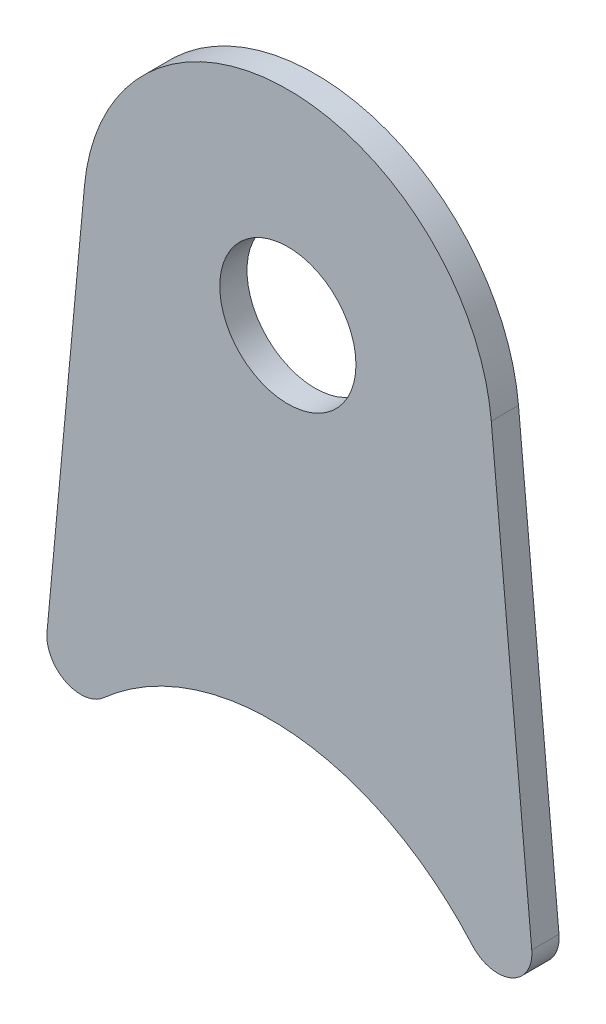
ISO-10303-21;
HEADER;
FILE_DESCRIPTION(('STEP AP214'),'2;1');
FILE_NAME('part.step','',(''),(''),'','','');
FILE_SCHEMA(('AUTOMOTIVE_DESIGN { 1 0 10303 214 1 1 1 1 }'));
ENDSEC;
DATA;
#1=APPLICATION_CONTEXT('core data for automotive mechanical design processes');
#2=APPLICATION_PROTOCOL_DEFINITION('international standard','automotive_design',2000,#1);
#3=PRODUCT_CONTEXT('',#1,'mechanical');
#4=PRODUCT('Part','Part','',(#3));
#5=PRODUCT_RELATED_PRODUCT_CATEGORY('part','',(#4));
#6=PRODUCT_DEFINITION_FORMATION('','',#4);
#7=PRODUCT_DEFINITION_CONTEXT('part definition',#1,'design');
#8=PRODUCT_DEFINITION('design','',#6,#7);
#9=PRODUCT_DEFINITION_SHAPE('','',#8);
#10=(LENGTH_UNIT() NAMED_UNIT(*) SI_UNIT(.MILLI.,.METRE.));
#11=(NAMED_UNIT(*) PLANE_ANGLE_UNIT() SI_UNIT($,.RADIAN.));
#12=(NAMED_UNIT(*) SI_UNIT($,.STERADIAN.) SOLID_ANGLE_UNIT());
#13=UNCERTAINTY_MEASURE_WITH_UNIT(LENGTH_MEASURE(1.E-05),#10,'distance_accuracy_value','');
#14=(GEOMETRIC_REPRESENTATION_CONTEXT(3) GLOBAL_UNCERTAINTY_ASSIGNED_CONTEXT((#13)) GLOBAL_UNIT_ASSIGNED_CONTEXT((#10,
#11,#12)) REPRESENTATION_CONTEXT('',''));
#15=CARTESIAN_POINT('',(0.,0.,0.));
#16=DIRECTION('',(0.,0.,1.));
#17=DIRECTION('',(1.,0.,0.));
#18=AXIS2_PLACEMENT_3D('',#15,#16,#17);
#19=CARTESIAN_POINT('',(12.7,-33.8997234501994,0.635));
#20=DIRECTION('',(0.99575277517188,0.0920674249531236,0.));
#21=DIRECTION('',(-0.0920674249531236,0.99575277517188,0.));
#22=AXIS2_PLACEMENT_3D('',#19,#20,#21);
#23=PLANE('',#22);
#24=DIRECTION('',(-0.0920674249531236,0.99575277517188,0.));
#25=VECTOR('',#24,1.);
#26=CARTESIAN_POINT('',(12.7,-33.8997234501994,0.635));
#27=LINE('',#26,#25);
#28=CARTESIAN_POINT('',(11.3719193962476,-19.5359031574981,0.635));
#29=VERTEX_POINT('',#28);
#30=CARTESIAN_POINT('',(9.48454518351216,0.876942222678502,0.635));
#31=VERTEX_POINT('',#30);
#32=EDGE_CURVE('E127',#29,#31,#27,.T.);
#33=ORIENTED_EDGE('',*,*,#32,.F.);
#34=DIRECTION('',(0.,0.,1.));
#35=VECTOR('',#34,1.);
#36=CARTESIAN_POINT('',(11.3719193962476,-19.5359031574981,-0.635));
#37=LINE('',#36,#35);
#38=CARTESIAN_POINT('',(11.3719193962476,-19.5359031574981,-0.635));
#39=VERTEX_POINT('',#38);
#40=EDGE_CURVE('E113',#39,#29,#37,.T.);
#41=ORIENTED_EDGE('',*,*,#40,.F.);
#42=DIRECTION('',(-0.0920674249531236,0.99575277517188,0.));
#43=VECTOR('',#42,1.);
#44=CARTESIAN_POINT('',(12.7,-33.8997234501994,-0.635));
#45=LINE('',#44,#43);
#46=CARTESIAN_POINT('',(9.48454518351216,0.876942222678502,-0.635));
#47=VERTEX_POINT('',#46);
#48=EDGE_CURVE('E125',#39,#47,#45,.T.);
#49=ORIENTED_EDGE('',*,*,#48,.T.);
#50=DIRECTION('',(0.,0.,1.));
#51=VECTOR('',#50,1.);
#52=CARTESIAN_POINT('',(9.48454518351216,0.876942222678502,0.635));
#53=LINE('',#52,#51);
#54=EDGE_CURVE('E137',#47,#31,#53,.T.);
#55=ORIENTED_EDGE('',*,*,#54,.T.);
#56=EDGE_LOOP('',(#33,#41,#49,#55));
#57=FACE_BOUND('',#56,.T.);
#58=ADVANCED_FACE('F45',(#57),#23,.T.);
#59=CARTESIAN_POINT('',(-9.48454518351216,0.876942222678502,0.635));
#60=DIRECTION('',(-0.99575277517188,0.0920674249531236,0.));
#61=DIRECTION('',(-0.0920674249531236,-0.99575277517188,0.));
#62=AXIS2_PLACEMENT_3D('',#59,#60,#61);
#63=PLANE('',#62);
#64=DIRECTION('',(-0.0920674249531236,-0.99575277517188,0.));
#65=VECTOR('',#64,1.);
#66=CARTESIAN_POINT('',(-9.48454518351216,0.876942222678502,-0.635));
#67=LINE('',#66,#65);
#68=CARTESIAN_POINT('',(-9.48454518351216,0.876942222678502,-0.635));
#69=VERTEX_POINT('',#68);
#70=CARTESIAN_POINT('',(-11.2300340747714,-18.001346253273,-0.635));
#71=VERTEX_POINT('',#70);
#72=EDGE_CURVE('E145',#69,#71,#67,.T.);
#73=ORIENTED_EDGE('',*,*,#72,.T.);
#74=DIRECTION('',(0.,0.,-1.));
#75=VECTOR('',#74,1.);
#76=CARTESIAN_POINT('',(-11.2300340747714,-18.001346253273,0.635));
#77=LINE('',#76,#75);
#78=CARTESIAN_POINT('',(-11.2300340747714,-18.001346253273,0.635));
#79=VERTEX_POINT('',#78);
#80=EDGE_CURVE('E163',#71,#79,#77,.F.);
#81=ORIENTED_EDGE('',*,*,#80,.T.);
#82=DIRECTION('',(-0.0920674249531236,-0.99575277517188,0.));
#83=VECTOR('',#82,1.);
#84=CARTESIAN_POINT('',(-9.48454518351216,0.876942222678502,0.635));
#85=LINE('',#84,#83);
#86=CARTESIAN_POINT('',(-9.48454518351216,0.876942222678502,0.635));
#87=VERTEX_POINT('',#86);
#88=EDGE_CURVE('E155',#87,#79,#85,.T.);
#89=ORIENTED_EDGE('',*,*,#88,.F.);
#90=DIRECTION('',(0.,0.,1.));
#91=VECTOR('',#90,1.);
#92=CARTESIAN_POINT('',(-9.48454518351216,0.876942222678502,0.635));
#93=LINE('',#92,#91);
#94=EDGE_CURVE('E150',#69,#87,#93,.T.);
#95=ORIENTED_EDGE('',*,*,#94,.F.);
#96=EDGE_LOOP('',(#73,#81,#89,#95));
#97=FACE_BOUND('',#96,.T.);
#98=ADVANCED_FACE('F211',(#97),#63,.T.);
#99=CARTESIAN_POINT('',(0.,0.,-0.635));
#100=DIRECTION('',(0.,0.,1.));
#101=DIRECTION('',(1.,0.,0.));
#102=AXIS2_PLACEMENT_3D('',#99,#100,#101);
#103=PLANE('',#102);
#104=CARTESIAN_POINT('',(-0.421500479160703,-30.3195912281245,-0.635));
#105=DIRECTION('',(0.,0.,1.));
#106=DIRECTION('',(0.145630371604524,-0.989339069715903,0.));
#107=AXIS2_PLACEMENT_3D('',#104,#105,#106);
#108=ELLIPSE('',#107,14.0258719552537,12.7);
#109=CARTESIAN_POINT('',(8.59970837398635,-20.7311525771845,-0.635));
#110=VERTEX_POINT('',#109);
#111=CARTESIAN_POINT('',(-8.59446776507534,-19.3338989619524,-0.635));
#112=VERTEX_POINT('',#111);
#113=EDGE_CURVE('E120',#110,#112,#108,.T.);
#114=ORIENTED_EDGE('',*,*,#113,.T.);
#115=CARTESIAN_POINT('',(-9.64927654418587,-18.1475032903861,-0.635));
#116=DIRECTION('',(0.,0.,1.));
#117=DIRECTION('',(1.,0.,0.));
#118=AXIS2_PLACEMENT_3D('',#115,#116,#117);
#119=CIRCLE('',#118,1.5875);
#120=EDGE_CURVE('E11',#112,#71,#119,.F.);
#121=ORIENTED_EDGE('',*,*,#120,.T.);
#122=ORIENTED_EDGE('',*,*,#72,.F.);
#123=CARTESIAN_POINT('',(0.,0.,-0.635));
#124=DIRECTION('',(0.,0.,1.));
#125=DIRECTION('',(1.,0.,0.));
#126=AXIS2_PLACEMENT_3D('',#123,#124,#125);
#127=CIRCLE('',#126,9.525);
#128=EDGE_CURVE('E135',#47,#69,#127,.T.);
#129=ORIENTED_EDGE('',*,*,#128,.F.);
#130=ORIENTED_EDGE('',*,*,#48,.F.);
#131=CARTESIAN_POINT('',(9.7911618656622,-19.6820601946112,-0.635));
#132=DIRECTION('',(0.,0.,-1.));
#133=DIRECTION('',(1.,0.,0.));
#134=AXIS2_PLACEMENT_3D('',#131,#132,#133);
#135=CIRCLE('',#134,1.5875);
#136=EDGE_CURVE('E109',#39,#110,#135,.T.);
#137=ORIENTED_EDGE('',*,*,#136,.T.);
#138=EDGE_LOOP('',(#114,#121,#122,#129,#130,#137));
#139=FACE_BOUND('',#138,.T.);
#140=CARTESIAN_POINT('',(0.,0.,-0.635));
#141=DIRECTION('',(0.,0.,1.));
#142=DIRECTION('',(1.,0.,0.));
#143=AXIS2_PLACEMENT_3D('',#140,#141,#142);
#144=CIRCLE('',#143,3.175);
#145=CARTESIAN_POINT('',(3.175,0.,-0.635));
#146=VERTEX_POINT('',#145);
#147=EDGE_CURVE('E138',#146,#146,#144,.T.);
#148=ORIENTED_EDGE('',*,*,#147,.T.);
#149=EDGE_LOOP('',(#148));
#150=FACE_BOUND('',#149,.T.);
#151=ADVANCED_FACE('F131',(#139,#150),#103,.F.);
#152=CARTESIAN_POINT('',(0.,0.,0.635));
#153=DIRECTION('',(0.,0.,1.));
#154=DIRECTION('',(1.,0.,0.));
#155=AXIS2_PLACEMENT_3D('',#152,#153,#154);
#156=CYLINDRICAL_SURFACE('',#155,9.525);
#157=ORIENTED_EDGE('',*,*,#54,.F.);
#158=ORIENTED_EDGE('',*,*,#128,.T.);
#159=ORIENTED_EDGE('',*,*,#94,.T.);
#160=CARTESIAN_POINT('',(0.,0.,0.635));
#161=DIRECTION('',(0.,0.,1.));
#162=DIRECTION('',(1.,0.,0.));
#163=AXIS2_PLACEMENT_3D('',#160,#161,#162);
#164=CIRCLE('',#163,9.525);
#165=EDGE_CURVE('E158',#31,#87,#164,.T.);
#166=ORIENTED_EDGE('',*,*,#165,.F.);
#167=EDGE_LOOP('',(#157,#158,#159,#166));
#168=FACE_BOUND('',#167,.T.);
#169=ADVANCED_FACE('F207',(#168),#156,.T.);
#170=CARTESIAN_POINT('',(0.,0.,0.635));
#171=DIRECTION('',(0.,0.,1.));
#172=DIRECTION('',(1.,0.,0.));
#173=AXIS2_PLACEMENT_3D('',#170,#171,#172);
#174=CYLINDRICAL_SURFACE('',#173,3.175);
#175=CARTESIAN_POINT('',(0.,0.,0.635));
#176=DIRECTION('',(0.,0.,1.));
#177=DIRECTION('',(1.,0.,0.));
#178=AXIS2_PLACEMENT_3D('',#175,#176,#177);
#179=CIRCLE('',#178,3.175);
#180=CARTESIAN_POINT('',(3.175,0.,0.635));
#181=VERTEX_POINT('',#180);
#182=EDGE_CURVE('E151',#181,#181,#179,.T.);
#183=ORIENTED_EDGE('',*,*,#182,.T.);
#184=EDGE_LOOP('',(#183));
#185=FACE_BOUND('',#184,.T.);
#186=ORIENTED_EDGE('',*,*,#147,.F.);
#187=EDGE_LOOP('',(#186));
#188=FACE_BOUND('',#187,.T.);
#189=ADVANCED_FACE('F204',(#185,#188),#174,.F.);
#190=CARTESIAN_POINT('',(0.,0.,0.635));
#191=DIRECTION('',(0.,0.,1.));
#192=DIRECTION('',(1.,0.,0.));
#193=AXIS2_PLACEMENT_3D('',#190,#191,#192);
#194=PLANE('',#193);
#195=ORIENTED_EDGE('',*,*,#88,.T.);
#196=CARTESIAN_POINT('',(-9.64927654418587,-18.1475032903861,0.635));
#197=DIRECTION('',(0.,0.,1.));
#198=DIRECTION('',(1.,0.,0.));
#199=AXIS2_PLACEMENT_3D('',#196,#197,#198);
#200=CIRCLE('',#199,1.5875);
#201=CARTESIAN_POINT('',(-8.59446776507534,-19.3338989619524,0.635));
#202=VERTEX_POINT('',#201);
#203=EDGE_CURVE('E72',#79,#202,#200,.T.);
#204=ORIENTED_EDGE('',*,*,#203,.T.);
#205=CARTESIAN_POINT('',(-0.421500479160703,-30.3195912281245,0.635));
#206=DIRECTION('',(0.,0.,1.));
#207=DIRECTION('',(0.145630371604524,-0.989339069715903,0.));
#208=AXIS2_PLACEMENT_3D('',#205,#206,#207);
#209=ELLIPSE('',#208,14.0258719552537,12.7);
#210=CARTESIAN_POINT('',(8.59970837398634,-20.7311525771845,0.635));
#211=VERTEX_POINT('',#210);
#212=EDGE_CURVE('E159',#202,#211,#209,.F.);
#213=ORIENTED_EDGE('',*,*,#212,.T.);
#214=CARTESIAN_POINT('',(9.7911618656622,-19.6820601946112,0.635));
#215=DIRECTION('',(0.,0.,-1.));
#216=DIRECTION('',(1.,0.,0.));
#217=AXIS2_PLACEMENT_3D('',#214,#215,#216);
#218=CIRCLE('',#217,1.5875);
#219=EDGE_CURVE('E171',#29,#211,#218,.T.);
#220=ORIENTED_EDGE('',*,*,#219,.F.);
#221=ORIENTED_EDGE('',*,*,#32,.T.);
#222=ORIENTED_EDGE('',*,*,#165,.T.);
#223=EDGE_LOOP('',(#195,#204,#213,#220,#221,#222));
#224=FACE_BOUND('',#223,.T.);
#225=ORIENTED_EDGE('',*,*,#182,.F.);
#226=EDGE_LOOP('',(#225));
#227=FACE_BOUND('',#226,.T.);
#228=ADVANCED_FACE('F203',(#224,#227),#194,.T.);
#229=DIRECTION('',(0.,0.,1.));
#230=VECTOR('',#229,1.);
#231=SURFACE_OF_LINEAR_EXTRUSION('',#108,#230);
#232=ORIENTED_EDGE('',*,*,#212,.F.);
#233=DIRECTION('',(0.,0.,1.));
#234=VECTOR('',#233,1.);
#235=CARTESIAN_POINT('',(-8.59446776507534,-19.3338989619524,0.635));
#236=LINE('',#235,#234);
#237=EDGE_CURVE('E54',#202,#112,#236,.F.);
#238=ORIENTED_EDGE('',*,*,#237,.T.);
#239=ORIENTED_EDGE('',*,*,#113,.F.);
#240=DIRECTION('',(0.,0.,1.));
#241=VECTOR('',#240,1.);
#242=CARTESIAN_POINT('',(8.59970837398635,-20.7311525771845,-0.635));
#243=LINE('',#242,#241);
#244=EDGE_CURVE('E116',#110,#211,#243,.T.);
#245=ORIENTED_EDGE('',*,*,#244,.T.);
#246=EDGE_LOOP('',(#232,#238,#239,#245));
#247=FACE_BOUND('',#246,.T.);
#248=ADVANCED_FACE('F186',(#247),#231,.F.);
#249=CARTESIAN_POINT('',(9.7911618656622,-19.6820601946112,-0.635));
#250=DIRECTION('',(0.,0.,1.));
#251=DIRECTION('',(1.,0.,0.));
#252=AXIS2_PLACEMENT_3D('',#249,#250,#251);
#253=CYLINDRICAL_SURFACE('',#252,1.5875);
#254=ORIENTED_EDGE('',*,*,#219,.T.);
#255=ORIENTED_EDGE('',*,*,#244,.F.);
#256=ORIENTED_EDGE('',*,*,#136,.F.);
#257=ORIENTED_EDGE('',*,*,#40,.T.);
#258=EDGE_LOOP('',(#254,#255,#256,#257));
#259=FACE_BOUND('',#258,.T.);
#260=ADVANCED_FACE('F112',(#259),#253,.T.);
#261=CARTESIAN_POINT('',(-9.64927654418587,-18.1475032903861,0.));
#262=DIRECTION('',(0.,0.,1.));
#263=DIRECTION('',(1.,0.,0.));
#264=AXIS2_PLACEMENT_3D('',#261,#262,#263);
#265=CYLINDRICAL_SURFACE('',#264,1.5875);
#266=ORIENTED_EDGE('',*,*,#120,.F.);
#267=ORIENTED_EDGE('',*,*,#237,.F.);
#268=ORIENTED_EDGE('',*,*,#203,.F.);
#269=ORIENTED_EDGE('',*,*,#80,.F.);
#270=EDGE_LOOP('',(#266,#267,#268,#269));
#271=FACE_BOUND('',#270,.T.);
#272=ADVANCED_FACE('F47',(#271),#265,.T.);
#273=CLOSED_SHELL('',(#58,#98,#151,#169,#189,#228,#248,#260,#272));
#274=MANIFOLD_SOLID_BREP('B2',#273);
#275=ADVANCED_BREP_SHAPE_REPRESENTATION('',(#18,#274),#14);
#276=SHAPE_DEFINITION_REPRESENTATION(#9,#275);
ENDSEC;
END-ISO-10303-21;
